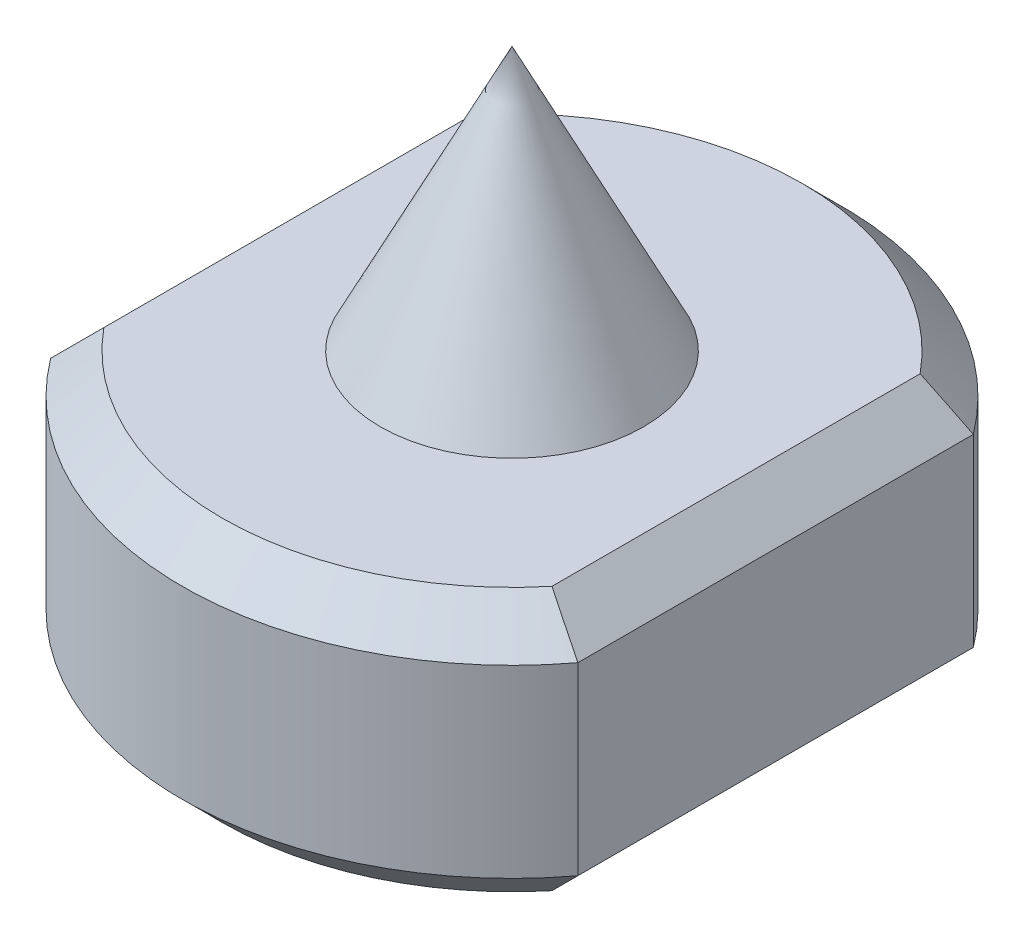
ISO-10303-21;
HEADER;
FILE_DESCRIPTION(('STEP AP214'),'2;1');
FILE_NAME('part.step','',(''),(''),'','','');
FILE_SCHEMA(('AUTOMOTIVE_DESIGN { 1 0 10303 214 1 1 1 1 }'));
ENDSEC;
DATA;
#1=APPLICATION_CONTEXT('core data for automotive mechanical design processes');
#2=APPLICATION_PROTOCOL_DEFINITION('international standard','automotive_design',2000,#1);
#3=PRODUCT_CONTEXT('',#1,'mechanical');
#4=PRODUCT('Part','Part','',(#3));
#5=PRODUCT_RELATED_PRODUCT_CATEGORY('part','',(#4));
#6=PRODUCT_DEFINITION_FORMATION('','',#4);
#7=PRODUCT_DEFINITION_CONTEXT('part definition',#1,'design');
#8=PRODUCT_DEFINITION('design','',#6,#7);
#9=PRODUCT_DEFINITION_SHAPE('','',#8);
#10=(LENGTH_UNIT() NAMED_UNIT(*) SI_UNIT(.MILLI.,.METRE.));
#11=(NAMED_UNIT(*) PLANE_ANGLE_UNIT() SI_UNIT($,.RADIAN.));
#12=(NAMED_UNIT(*) SI_UNIT($,.STERADIAN.) SOLID_ANGLE_UNIT());
#13=UNCERTAINTY_MEASURE_WITH_UNIT(LENGTH_MEASURE(1.E-05),#10,'distance_accuracy_value','');
#14=(GEOMETRIC_REPRESENTATION_CONTEXT(3) GLOBAL_UNCERTAINTY_ASSIGNED_CONTEXT((#13)) GLOBAL_UNIT_ASSIGNED_CONTEXT((#10,
#11,#12)) REPRESENTATION_CONTEXT('',''));
#15=CARTESIAN_POINT('',(0.,0.,0.));
#16=DIRECTION('',(0.,0.,1.));
#17=DIRECTION('',(1.,0.,0.));
#18=AXIS2_PLACEMENT_3D('',#15,#16,#17);
#19=CARTESIAN_POINT('',(0.,10.,0.));
#20=DIRECTION('',(0.,-1.,0.));
#21=DIRECTION('',(0.,0.,-1.));
#22=AXIS2_PLACEMENT_3D('',#19,#20,#21);
#23=CYLINDRICAL_SURFACE('',#22,12.5);
#24=DIRECTION('',(0.,-1.,0.));
#25=VECTOR('',#24,1.);
#26=CARTESIAN_POINT('',(10.,20.001,-7.5));
#27=LINE('',#26,#25);
#28=CARTESIAN_POINT('',(10.,8.5,-7.5));
#29=VERTEX_POINT('',#28);
#30=CARTESIAN_POINT('',(10.,1.50000000000001,-7.5));
#31=VERTEX_POINT('',#30);
#32=EDGE_CURVE('E127',#29,#31,#27,.T.);
#33=ORIENTED_EDGE('',*,*,#32,.T.);
#34=CARTESIAN_POINT('',(0.,1.5,0.));
#35=DIRECTION('',(0.,1.,0.));
#36=DIRECTION('',(0.,0.,1.));
#37=AXIS2_PLACEMENT_3D('',#34,#35,#36);
#38=CIRCLE('',#37,12.5);
#39=CARTESIAN_POINT('',(-10.,1.50000000000001,-7.5));
#40=VERTEX_POINT('',#39);
#41=EDGE_CURVE('E147',#31,#40,#38,.T.);
#42=ORIENTED_EDGE('',*,*,#41,.T.);
#43=DIRECTION('',(0.,-1.,0.));
#44=VECTOR('',#43,1.);
#45=CARTESIAN_POINT('',(-10.,20.001,-7.5));
#46=LINE('',#45,#44);
#47=CARTESIAN_POINT('',(-10.,8.5,-7.5));
#48=VERTEX_POINT('',#47);
#49=EDGE_CURVE('E124',#48,#40,#46,.T.);
#50=ORIENTED_EDGE('',*,*,#49,.F.);
#51=CARTESIAN_POINT('',(0.,8.5,0.));
#52=DIRECTION('',(0.,1.,0.));
#53=DIRECTION('',(0.,0.,1.));
#54=AXIS2_PLACEMENT_3D('',#51,#52,#53);
#55=CIRCLE('',#54,12.5);
#56=EDGE_CURVE('E145',#48,#29,#55,.F.);
#57=ORIENTED_EDGE('',*,*,#56,.T.);
#58=EDGE_LOOP('',(#33,#42,#50,#57));
#59=FACE_BOUND('',#58,.T.);
#60=ADVANCED_FACE('F36',(#59),#23,.T.);
#61=DIRECTION('',(0.,-1.,0.));
#62=VECTOR('',#61,1.);
#63=CARTESIAN_POINT('',(-10.,20.001,7.5));
#64=LINE('',#63,#62);
#65=CARTESIAN_POINT('',(-10.,8.5,7.5));
#66=VERTEX_POINT('',#65);
#67=CARTESIAN_POINT('',(-10.,1.50000000000001,7.5));
#68=VERTEX_POINT('',#67);
#69=EDGE_CURVE('E119',#66,#68,#64,.T.);
#70=ORIENTED_EDGE('',*,*,#69,.T.);
#71=CARTESIAN_POINT('',(0.,1.5,0.));
#72=DIRECTION('',(0.,1.,0.));
#73=DIRECTION('',(0.,0.,1.));
#74=AXIS2_PLACEMENT_3D('',#71,#72,#73);
#75=CIRCLE('',#74,12.5);
#76=CARTESIAN_POINT('',(10.,1.50000000000001,7.5));
#77=VERTEX_POINT('',#76);
#78=EDGE_CURVE('E121',#68,#77,#75,.T.);
#79=ORIENTED_EDGE('',*,*,#78,.T.);
#80=DIRECTION('',(0.,-1.,0.));
#81=VECTOR('',#80,1.);
#82=CARTESIAN_POINT('',(10.,20.001,7.5));
#83=LINE('',#82,#81);
#84=CARTESIAN_POINT('',(10.,8.5,7.5));
#85=VERTEX_POINT('',#84);
#86=EDGE_CURVE('E206',#85,#77,#83,.T.);
#87=ORIENTED_EDGE('',*,*,#86,.F.);
#88=CARTESIAN_POINT('',(0.,8.5,0.));
#89=DIRECTION('',(0.,1.,0.));
#90=DIRECTION('',(0.,0.,1.));
#91=AXIS2_PLACEMENT_3D('',#88,#89,#90);
#92=CIRCLE('',#91,12.5);
#93=EDGE_CURVE('E118',#85,#66,#92,.F.);
#94=ORIENTED_EDGE('',*,*,#93,.T.);
#95=EDGE_LOOP('',(#70,#79,#87,#94));
#96=FACE_BOUND('',#95,.T.);
#97=ADVANCED_FACE('F251',(#96),#23,.T.);
#98=CARTESIAN_POINT('',(0.,10.,0.));
#99=DIRECTION('',(0.,1.,0.));
#100=DIRECTION('',(0.,0.,1.));
#101=AXIS2_PLACEMENT_3D('',#98,#99,#100);
#102=PLANE('',#101);
#103=CARTESIAN_POINT('',(0.,10.,0.));
#104=DIRECTION('',(0.,1.,0.));
#105=DIRECTION('',(0.,0.,1.));
#106=AXIS2_PLACEMENT_3D('',#103,#104,#105);
#107=CIRCLE('',#106,11.);
#108=CARTESIAN_POINT('',(8.50000000000001,10.,-6.98212002188448));
#109=VERTEX_POINT('',#108);
#110=CARTESIAN_POINT('',(-8.50000000000001,10.,-6.98212002188448));
#111=VERTEX_POINT('',#110);
#112=EDGE_CURVE('E51',#109,#111,#107,.T.);
#113=ORIENTED_EDGE('',*,*,#112,.T.);
#114=DIRECTION('',(0.,0.,1.));
#115=VECTOR('',#114,1.);
#116=CARTESIAN_POINT('',(-8.50000000000001,10.,0.));
#117=LINE('',#116,#115);
#118=CARTESIAN_POINT('',(-8.50000000000001,10.,6.98212002188448));
#119=VERTEX_POINT('',#118);
#120=EDGE_CURVE('E12',#111,#119,#117,.T.);
#121=ORIENTED_EDGE('',*,*,#120,.T.);
#122=CARTESIAN_POINT('',(0.,10.,0.));
#123=DIRECTION('',(0.,1.,0.));
#124=DIRECTION('',(0.,0.,1.));
#125=AXIS2_PLACEMENT_3D('',#122,#123,#124);
#126=CIRCLE('',#125,11.);
#127=CARTESIAN_POINT('',(8.50000000000001,10.,6.98212002188448));
#128=VERTEX_POINT('',#127);
#129=EDGE_CURVE('E154',#119,#128,#126,.T.);
#130=ORIENTED_EDGE('',*,*,#129,.T.);
#131=DIRECTION('',(0.,0.,-1.));
#132=VECTOR('',#131,1.);
#133=CARTESIAN_POINT('',(8.50000000000001,10.,0.));
#134=LINE('',#133,#132);
#135=EDGE_CURVE('E62',#128,#109,#134,.T.);
#136=ORIENTED_EDGE('',*,*,#135,.T.);
#137=EDGE_LOOP('',(#113,#121,#130,#136));
#138=FACE_BOUND('',#137,.T.);
#139=CARTESIAN_POINT('',(0.,10.,0.));
#140=DIRECTION('',(0.,1.,0.));
#141=DIRECTION('',(0.,0.,1.));
#142=AXIS2_PLACEMENT_3D('',#139,#140,#141);
#143=CIRCLE('',#142,5.00000000000004);
#144=CARTESIAN_POINT('',(0.,10.,5.00000000000005));
#145=VERTEX_POINT('',#144);
#146=EDGE_CURVE('E116',#145,#145,#143,.T.);
#147=ORIENTED_EDGE('',*,*,#146,.F.);
#148=EDGE_LOOP('',(#147));
#149=FACE_BOUND('',#148,.T.);
#150=ADVANCED_FACE('F256',(#138,#149),#102,.T.);
#151=CARTESIAN_POINT('',(0.,0.,0.));
#152=DIRECTION('',(0.,1.,0.));
#153=DIRECTION('',(0.,0.,1.));
#154=AXIS2_PLACEMENT_3D('',#151,#152,#153);
#155=PLANE('',#154);
#156=DIRECTION('',(0.,0.,1.));
#157=VECTOR('',#156,1.);
#158=CARTESIAN_POINT('',(8.49999999999999,0.,7.50000000000001));
#159=LINE('',#158,#157);
#160=CARTESIAN_POINT('',(8.49999999999999,0.,-6.98212002188448));
#161=VERTEX_POINT('',#160);
#162=CARTESIAN_POINT('',(8.49999999999999,0.,6.98212002188447));
#163=VERTEX_POINT('',#162);
#164=EDGE_CURVE('E136',#161,#163,#159,.T.);
#165=ORIENTED_EDGE('',*,*,#164,.T.);
#166=CARTESIAN_POINT('',(0.,0.,0.));
#167=DIRECTION('',(0.,1.,0.));
#168=DIRECTION('',(0.,0.,1.));
#169=AXIS2_PLACEMENT_3D('',#166,#167,#168);
#170=CIRCLE('',#169,11.);
#171=CARTESIAN_POINT('',(-8.49999999999999,0.,6.98212002188448));
#172=VERTEX_POINT('',#171);
#173=EDGE_CURVE('E138',#163,#172,#170,.F.);
#174=ORIENTED_EDGE('',*,*,#173,.T.);
#175=DIRECTION('',(0.,0.,-1.));
#176=VECTOR('',#175,1.);
#177=CARTESIAN_POINT('',(-8.49999999999999,0.,-7.50000000000001));
#178=LINE('',#177,#176);
#179=CARTESIAN_POINT('',(-8.49999999999999,0.,-6.98212002188447));
#180=VERTEX_POINT('',#179);
#181=EDGE_CURVE('E132',#172,#180,#178,.T.);
#182=ORIENTED_EDGE('',*,*,#181,.T.);
#183=CARTESIAN_POINT('',(0.,0.,0.));
#184=DIRECTION('',(0.,1.,0.));
#185=DIRECTION('',(0.,0.,1.));
#186=AXIS2_PLACEMENT_3D('',#183,#184,#185);
#187=CIRCLE('',#186,11.);
#188=EDGE_CURVE('E134',#180,#161,#187,.F.);
#189=ORIENTED_EDGE('',*,*,#188,.T.);
#190=EDGE_LOOP('',(#165,#174,#182,#189));
#191=FACE_BOUND('',#190,.T.);
#192=ADVANCED_FACE('F112',(#191),#155,.F.);
#193=CARTESIAN_POINT('',(0.,10.,0.));
#194=DIRECTION('',(0.,-1.,0.));
#195=DIRECTION('',(1.,0.,0.));
#196=AXIS2_PLACEMENT_3D('',#193,#194,#195);
#197=CONICAL_SURFACE('',#196,5.00000000000003,0.463647609000803);
#198=CARTESIAN_POINT('',(0.,20.,0.));
#199=VERTEX_POINT('',#198);
#200=VERTEX_LOOP('',#199);
#201=FACE_BOUND('',#200,.T.);
#202=ORIENTED_EDGE('',*,*,#146,.T.);
#203=EDGE_LOOP('',(#202));
#204=FACE_BOUND('',#203,.T.);
#205=ADVANCED_FACE('F108',(#201,#204),#197,.T.);
#206=CARTESIAN_POINT('',(10.,20.001,-7.5));
#207=DIRECTION('',(1.,0.,0.));
#208=DIRECTION('',(0.,0.,-1.));
#209=AXIS2_PLACEMENT_3D('',#206,#207,#208);
#210=PLANE('',#209);
#211=ORIENTED_EDGE('',*,*,#86,.T.);
#212=DIRECTION('',(0.,0.,-1.));
#213=VECTOR('',#212,1.);
#214=CARTESIAN_POINT('',(10.,1.5,-7.5));
#215=LINE('',#214,#213);
#216=EDGE_CURVE('E143',#77,#31,#215,.T.);
#217=ORIENTED_EDGE('',*,*,#216,.T.);
#218=ORIENTED_EDGE('',*,*,#32,.F.);
#219=DIRECTION('',(0.,0.,1.));
#220=VECTOR('',#219,1.);
#221=CARTESIAN_POINT('',(10.,8.5,-7.5));
#222=LINE('',#221,#220);
#223=EDGE_CURVE('E141',#29,#85,#222,.T.);
#224=ORIENTED_EDGE('',*,*,#223,.T.);
#225=EDGE_LOOP('',(#211,#217,#218,#224));
#226=FACE_BOUND('',#225,.T.);
#227=ADVANCED_FACE('F111',(#226),#210,.T.);
#228=CARTESIAN_POINT('',(-10.,20.001,-7.5));
#229=DIRECTION('',(-1.,0.,0.));
#230=DIRECTION('',(0.,0.,1.));
#231=AXIS2_PLACEMENT_3D('',#228,#229,#230);
#232=PLANE('',#231);
#233=ORIENTED_EDGE('',*,*,#49,.T.);
#234=DIRECTION('',(0.,0.,1.));
#235=VECTOR('',#234,1.);
#236=CARTESIAN_POINT('',(-10.,1.5,7.5));
#237=LINE('',#236,#235);
#238=EDGE_CURVE('E152',#40,#68,#237,.T.);
#239=ORIENTED_EDGE('',*,*,#238,.T.);
#240=ORIENTED_EDGE('',*,*,#69,.F.);
#241=DIRECTION('',(0.,0.,-1.));
#242=VECTOR('',#241,1.);
#243=CARTESIAN_POINT('',(-10.,8.5,-7.5));
#244=LINE('',#243,#242);
#245=EDGE_CURVE('E149',#66,#48,#244,.T.);
#246=ORIENTED_EDGE('',*,*,#245,.T.);
#247=EDGE_LOOP('',(#233,#239,#240,#246));
#248=FACE_BOUND('',#247,.T.);
#249=ADVANCED_FACE('F267',(#248),#232,.T.);
#250=CARTESIAN_POINT('',(0.,1.5,0.));
#251=DIRECTION('',(0.,1.,0.));
#252=DIRECTION('',(0.,0.,1.));
#253=AXIS2_PLACEMENT_3D('',#250,#251,#252);
#254=CONICAL_SURFACE('',#253,12.5,0.785398163397447);
#255=CARTESIAN_POINT('',(10.,1.5,-7.5));
#256=CARTESIAN_POINT('',(9.87475857854712,1.37475857854713,-7.4582523921052));
#257=CARTESIAN_POINT('',(9.74957195101714,1.24957195101715,-7.41617541421952));
#258=CARTESIAN_POINT('',(9.49931825351607,0.999318253516072,-7.33132952915024));
#259=CARTESIAN_POINT('',(9.37425118155252,0.874251181552524,-7.28856063371843));
#260=CARTESIAN_POINT('',(9.12424199013349,0.6242419901335,-7.20229619798288));
#261=CARTESIAN_POINT('',(8.99929987100312,0.499299871003127,-7.15880065579375));
#262=CARTESIAN_POINT('',(8.74954791229443,0.249547912294433,-7.07104396187436));
#263=CARTESIAN_POINT('',(8.62473807499675,0.124738074996753,-7.02678279716495));
#264=CARTESIAN_POINT('',(8.49999999999999,0.,-6.98212002188447));
#265=B_SPLINE_CURVE_WITH_KNOTS('',3,(#255,#256,#257,#258,#259,#260,#261,#262,#263,#264),
.UNSPECIFIED.,.F.,.F.,(4,2,2,2,4),(0.,0.545914907565414,1.09182055282098,1.63772761473342,
2.18364394018467),.UNSPECIFIED.);
#266=EDGE_CURVE('E207',#161,#31,#265,.F.);
#267=ORIENTED_EDGE('',*,*,#266,.F.);
#268=ORIENTED_EDGE('',*,*,#188,.F.);
#269=CARTESIAN_POINT('',(-10.,1.5,-7.5));
#270=CARTESIAN_POINT('',(-9.87475857854712,1.37475857854712,-7.4582523921052));
#271=CARTESIAN_POINT('',(-9.74957195101714,1.24957195101715,-7.41617541421952));
#272=CARTESIAN_POINT('',(-9.49931825351607,0.999318253516072,-7.33132952915024));
#273=CARTESIAN_POINT('',(-9.37425118155252,0.874251181552524,-7.28856063371843));
#274=CARTESIAN_POINT('',(-9.12424199013349,0.6242419901335,-7.20229619798288));
#275=CARTESIAN_POINT('',(-8.99929987100312,0.499299871003127,-7.15880065579375));
#276=CARTESIAN_POINT('',(-8.74954791229443,0.249547912294433,-7.07104396187436));
#277=CARTESIAN_POINT('',(-8.62473807499675,0.124738074996752,-7.02678279716495));
#278=CARTESIAN_POINT('',(-8.49999999999999,0.,-6.98212002188447));
#279=B_SPLINE_CURVE_WITH_KNOTS('',3,(#269,#270,#271,#272,#273,#274,#275,#276,#277,#278),
.UNSPECIFIED.,.F.,.F.,(4,2,2,2,4),(0.,0.545914907565414,1.09182055282098,1.63772761473342,
2.18364394018467),.UNSPECIFIED.);
#280=EDGE_CURVE('E199',#40,#180,#279,.T.);
#281=ORIENTED_EDGE('',*,*,#280,.F.);
#282=ORIENTED_EDGE('',*,*,#41,.F.);
#283=EDGE_LOOP('',(#267,#268,#281,#282));
#284=FACE_BOUND('',#283,.T.);
#285=ADVANCED_FACE('F193',(#284),#254,.T.);
#286=CARTESIAN_POINT('',(-8.49999999999999,0.,0.));
#287=DIRECTION('',(-0.707106781186548,-0.707106781186547,0.));
#288=DIRECTION('',(0.,0.,1.));
#289=AXIS2_PLACEMENT_3D('',#286,#287,#288);
#290=PLANE('',#289);
#291=ORIENTED_EDGE('',*,*,#280,.T.);
#292=ORIENTED_EDGE('',*,*,#181,.F.);
#293=CARTESIAN_POINT('',(-8.49999999999999,0.,6.98212002188448));
#294=CARTESIAN_POINT('',(-8.62473807499675,0.124738074996753,7.02678279716495));
#295=CARTESIAN_POINT('',(-8.74954791229443,0.249547912294433,7.07104396187436));
#296=CARTESIAN_POINT('',(-8.99929987100312,0.499299871003127,7.15880065579375));
#297=CARTESIAN_POINT('',(-9.12424199013349,0.6242419901335,7.20229619798288));
#298=CARTESIAN_POINT('',(-9.37425118155252,0.874251181552524,7.28856063371843));
#299=CARTESIAN_POINT('',(-9.49931825351607,0.999318253516072,7.33132952915024));
#300=CARTESIAN_POINT('',(-9.74957195101714,1.24957195101715,7.41617541421952));
#301=CARTESIAN_POINT('',(-9.87475857854712,1.37475857854713,7.4582523921052));
#302=CARTESIAN_POINT('',(-10.,1.50000000000001,7.50000000000001));
#303=B_SPLINE_CURVE_WITH_KNOTS('',3,(#293,#294,#295,#296,#297,#298,#299,#300,#301,#302),
.UNSPECIFIED.,.F.,.F.,(4,2,2,2,4),(0.,0.545916325451248,1.0918233873637,1.63772903261926,
2.18364394018467),.UNSPECIFIED.);
#304=EDGE_CURVE('E166',#68,#172,#303,.F.);
#305=ORIENTED_EDGE('',*,*,#304,.F.);
#306=ORIENTED_EDGE('',*,*,#238,.F.);
#307=EDGE_LOOP('',(#291,#292,#305,#306));
#308=FACE_BOUND('',#307,.T.);
#309=ADVANCED_FACE('F185',(#308),#290,.T.);
#310=CARTESIAN_POINT('',(8.49999999999999,0.,0.));
#311=DIRECTION('',(0.707106781186548,-0.707106781186547,0.));
#312=DIRECTION('',(0.,0.,-1.));
#313=AXIS2_PLACEMENT_3D('',#310,#311,#312);
#314=PLANE('',#313);
#315=ORIENTED_EDGE('',*,*,#266,.T.);
#316=ORIENTED_EDGE('',*,*,#216,.F.);
#317=CARTESIAN_POINT('',(10.,1.5,7.5));
#318=CARTESIAN_POINT('',(9.87475857854712,1.37475857854712,7.4582523921052));
#319=CARTESIAN_POINT('',(9.74957195101714,1.24957195101715,7.41617541421952));
#320=CARTESIAN_POINT('',(9.49931825351607,0.999318253516072,7.33132952915024));
#321=CARTESIAN_POINT('',(9.37425118155252,0.874251181552524,7.28856063371843));
#322=CARTESIAN_POINT('',(9.12424199013349,0.6242419901335,7.20229619798288));
#323=CARTESIAN_POINT('',(8.99929987100312,0.499299871003127,7.15880065579375));
#324=CARTESIAN_POINT('',(8.74954791229443,0.249547912294433,7.07104396187436));
#325=CARTESIAN_POINT('',(8.62473807499675,0.124738074996752,7.02678279716495));
#326=CARTESIAN_POINT('',(8.49999999999999,0.,6.98212002188447));
#327=B_SPLINE_CURVE_WITH_KNOTS('',3,(#317,#318,#319,#320,#321,#322,#323,#324,#325,#326),
.UNSPECIFIED.,.F.,.F.,(4,2,2,2,4),(0.,0.545914907565414,1.09182055282098,1.63772761473342,
2.18364394018467),.UNSPECIFIED.);
#328=EDGE_CURVE('E158',#163,#77,#327,.F.);
#329=ORIENTED_EDGE('',*,*,#328,.F.);
#330=ORIENTED_EDGE('',*,*,#164,.F.);
#331=EDGE_LOOP('',(#315,#316,#329,#330));
#332=FACE_BOUND('',#331,.T.);
#333=ADVANCED_FACE('F174',(#332),#314,.T.);
#334=CARTESIAN_POINT('',(0.,1.5,0.));
#335=DIRECTION('',(0.,1.,0.));
#336=DIRECTION('',(0.,0.,1.));
#337=AXIS2_PLACEMENT_3D('',#334,#335,#336);
#338=CONICAL_SURFACE('',#337,12.5,0.785398163397447);
#339=ORIENTED_EDGE('',*,*,#304,.T.);
#340=ORIENTED_EDGE('',*,*,#173,.F.);
#341=ORIENTED_EDGE('',*,*,#328,.T.);
#342=ORIENTED_EDGE('',*,*,#78,.F.);
#343=EDGE_LOOP('',(#339,#340,#341,#342));
#344=FACE_BOUND('',#343,.T.);
#345=ADVANCED_FACE('F178',(#344),#338,.T.);
#346=CARTESIAN_POINT('',(10.,8.5,-7.5));
#347=DIRECTION('',(-0.70710678118655,-0.707106781186545,0.));
#348=DIRECTION('',(0.,0.,1.));
#349=AXIS2_PLACEMENT_3D('',#346,#347,#348);
#350=PLANE('',#349);
#351=CARTESIAN_POINT('',(10.,8.5,-7.5));
#352=CARTESIAN_POINT('',(9.87475857854712,8.62524142145288,-7.4582523921052));
#353=CARTESIAN_POINT('',(9.74957195101714,8.75042804898285,-7.41617541421952));
#354=CARTESIAN_POINT('',(9.49931825351607,9.00068174648393,-7.33132952915024));
#355=CARTESIAN_POINT('',(9.37425118155252,9.12574881844748,-7.28856063371843));
#356=CARTESIAN_POINT('',(9.1242419901335,9.3757580098665,-7.20229619798288));
#357=CARTESIAN_POINT('',(8.99929987100313,9.50070012899687,-7.15880065579375));
#358=CARTESIAN_POINT('',(8.74954791229444,9.75045208770556,-7.07104396187437));
#359=CARTESIAN_POINT('',(8.62473807499676,9.87526192500325,-7.02678279716495));
#360=CARTESIAN_POINT('',(8.50000000000001,10.,-6.98212002188448));
#361=B_SPLINE_CURVE_WITH_KNOTS('',3,(#351,#352,#353,#354,#355,#356,#357,#358,#359,#360),
.UNSPECIFIED.,.F.,.F.,(4,2,2,2,4),(0.,0.54591490756541,1.09182055282097,1.63772761473341,
2.18364394018466),.UNSPECIFIED.);
#362=EDGE_CURVE('E299',#109,#29,#361,.F.);
#363=ORIENTED_EDGE('',*,*,#362,.F.);
#364=ORIENTED_EDGE('',*,*,#135,.F.);
#365=CARTESIAN_POINT('',(10.,8.5,7.5));
#366=CARTESIAN_POINT('',(9.87475857854712,8.62524142145288,7.4582523921052));
#367=CARTESIAN_POINT('',(9.74957195101714,8.75042804898285,7.41617541421952));
#368=CARTESIAN_POINT('',(9.49931825351607,9.00068174648393,7.33132952915024));
#369=CARTESIAN_POINT('',(9.37425118155252,9.12574881844748,7.28856063371843));
#370=CARTESIAN_POINT('',(9.1242419901335,9.3757580098665,7.20229619798288));
#371=CARTESIAN_POINT('',(8.99929987100313,9.50070012899687,7.15880065579375));
#372=CARTESIAN_POINT('',(8.74954791229444,9.75045208770556,7.07104396187437));
#373=CARTESIAN_POINT('',(8.62473807499676,9.87526192500325,7.02678279716495));
#374=CARTESIAN_POINT('',(8.50000000000001,10.,6.98212002188448));
#375=B_SPLINE_CURVE_WITH_KNOTS('',3,(#365,#366,#367,#368,#369,#370,#371,#372,#373,#374),
.UNSPECIFIED.,.F.,.F.,(4,2,2,2,4),(0.,0.54591490756541,1.09182055282097,1.63772761473341,
2.18364394018466),.UNSPECIFIED.);
#376=EDGE_CURVE('E42',#85,#128,#375,.T.);
#377=ORIENTED_EDGE('',*,*,#376,.F.);
#378=ORIENTED_EDGE('',*,*,#223,.F.);
#379=EDGE_LOOP('',(#363,#364,#377,#378));
#380=FACE_BOUND('',#379,.T.);
#381=ADVANCED_FACE('F39',(#380),#350,.F.);
#382=CARTESIAN_POINT('',(0.,10.,0.));
#383=DIRECTION('',(0.,-1.,0.));
#384=DIRECTION('',(0.,0.,-1.));
#385=AXIS2_PLACEMENT_3D('',#382,#383,#384);
#386=CONICAL_SURFACE('',#385,11.,0.785398163397445);
#387=ORIENTED_EDGE('',*,*,#376,.T.);
#388=ORIENTED_EDGE('',*,*,#129,.F.);
#389=CARTESIAN_POINT('',(-8.50000000000001,10.,6.98212002188448));
#390=CARTESIAN_POINT('',(-8.62473807499676,9.87526192500325,7.02678279716495));
#391=CARTESIAN_POINT('',(-8.74954791229444,9.75045208770557,7.07104396187437));
#392=CARTESIAN_POINT('',(-8.99929987100313,9.50070012899688,7.15880065579375));
#393=CARTESIAN_POINT('',(-9.1242419901335,9.3757580098665,7.20229619798288));
#394=CARTESIAN_POINT('',(-9.37425118155252,9.12574881844748,7.28856063371843));
#395=CARTESIAN_POINT('',(-9.49931825351607,9.00068174648393,7.33132952915024));
#396=CARTESIAN_POINT('',(-9.74957195101714,8.75042804898286,7.41617541421952));
#397=CARTESIAN_POINT('',(-9.87475857854712,8.62524142145288,7.4582523921052));
#398=CARTESIAN_POINT('',(-9.99999999999999,8.5,7.50000000000001));
#399=B_SPLINE_CURVE_WITH_KNOTS('',3,(#389,#390,#391,#392,#393,#394,#395,#396,#397,#398),
.UNSPECIFIED.,.F.,.F.,(4,2,2,2,4),(0.,0.545916325451246,1.09182338736369,1.63772903261925,
2.18364394018466),.UNSPECIFIED.);
#400=EDGE_CURVE('E219',#66,#119,#399,.F.);
#401=ORIENTED_EDGE('',*,*,#400,.F.);
#402=ORIENTED_EDGE('',*,*,#93,.F.);
#403=EDGE_LOOP('',(#387,#388,#401,#402));
#404=FACE_BOUND('',#403,.T.);
#405=ADVANCED_FACE('F235',(#404),#386,.T.);
#406=CARTESIAN_POINT('',(0.,10.,0.));
#407=DIRECTION('',(0.,-1.,0.));
#408=DIRECTION('',(0.,0.,-1.));
#409=AXIS2_PLACEMENT_3D('',#406,#407,#408);
#410=CONICAL_SURFACE('',#409,11.,0.785398163397445);
#411=ORIENTED_EDGE('',*,*,#362,.T.);
#412=ORIENTED_EDGE('',*,*,#56,.F.);
#413=CARTESIAN_POINT('',(-10.,8.5,-7.5));
#414=CARTESIAN_POINT('',(-9.87475857854712,8.62524142145288,-7.4582523921052));
#415=CARTESIAN_POINT('',(-9.74957195101714,8.75042804898285,-7.41617541421952));
#416=CARTESIAN_POINT('',(-9.49931825351607,9.00068174648393,-7.33132952915024));
#417=CARTESIAN_POINT('',(-9.37425118155252,9.12574881844748,-7.28856063371843));
#418=CARTESIAN_POINT('',(-9.1242419901335,9.3757580098665,-7.20229619798288));
#419=CARTESIAN_POINT('',(-8.99929987100313,9.50070012899687,-7.15880065579375));
#420=CARTESIAN_POINT('',(-8.74954791229444,9.75045208770556,-7.07104396187437));
#421=CARTESIAN_POINT('',(-8.62473807499676,9.87526192500325,-7.02678279716495));
#422=CARTESIAN_POINT('',(-8.50000000000001,10.,-6.98212002188448));
#423=B_SPLINE_CURVE_WITH_KNOTS('',3,(#413,#414,#415,#416,#417,#418,#419,#420,#421,#422),
.UNSPECIFIED.,.F.,.F.,(4,2,2,2,4),(0.,0.54591490756541,1.09182055282097,1.63772761473341,
2.18364394018466),.UNSPECIFIED.);
#424=EDGE_CURVE('E212',#111,#48,#423,.F.);
#425=ORIENTED_EDGE('',*,*,#424,.F.);
#426=ORIENTED_EDGE('',*,*,#112,.F.);
#427=EDGE_LOOP('',(#411,#412,#425,#426));
#428=FACE_BOUND('',#427,.T.);
#429=ADVANCED_FACE('F225',(#428),#410,.T.);
#430=CARTESIAN_POINT('',(-10.,8.5,-7.5));
#431=DIRECTION('',(0.70710678118655,-0.707106781186545,0.));
#432=DIRECTION('',(0.,0.,-1.));
#433=AXIS2_PLACEMENT_3D('',#430,#431,#432);
#434=PLANE('',#433);
#435=ORIENTED_EDGE('',*,*,#400,.T.);
#436=ORIENTED_EDGE('',*,*,#120,.F.);
#437=ORIENTED_EDGE('',*,*,#424,.T.);
#438=ORIENTED_EDGE('',*,*,#245,.F.);
#439=EDGE_LOOP('',(#435,#436,#437,#438));
#440=FACE_BOUND('',#439,.T.);
#441=ADVANCED_FACE('F228',(#440),#434,.F.);
#442=CLOSED_SHELL('',(#60,#97,#150,#192,#205,#227,#249,#285,#309,#333,#345,#381,#405,#429,#441));
#443=MANIFOLD_SOLID_BREP('B2',#442);
#444=ADVANCED_BREP_SHAPE_REPRESENTATION('',(#18,#443),#14);
#445=SHAPE_DEFINITION_REPRESENTATION(#9,#444);
ENDSEC;
END-ISO-10303-21;
